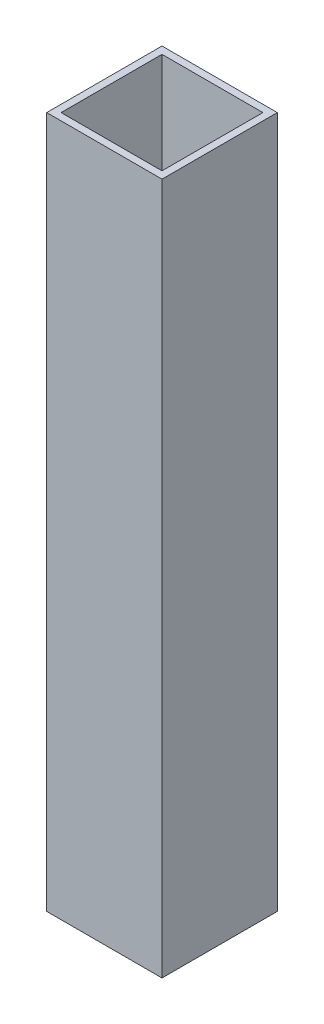
ISO-10303-21;
HEADER;
FILE_DESCRIPTION(('STEP AP214'),'2;1');
FILE_NAME('part.step','',(''),(''),'','','');
FILE_SCHEMA(('AUTOMOTIVE_DESIGN { 1 0 10303 214 1 1 1 1 }'));
ENDSEC;
DATA;
#1=APPLICATION_CONTEXT('core data for automotive mechanical design processes');
#2=APPLICATION_PROTOCOL_DEFINITION('international standard','automotive_design',2000,#1);
#3=PRODUCT_CONTEXT('',#1,'mechanical');
#4=PRODUCT('Part','Part','',(#3));
#5=PRODUCT_RELATED_PRODUCT_CATEGORY('part','',(#4));
#6=PRODUCT_DEFINITION_FORMATION('','',#4);
#7=PRODUCT_DEFINITION_CONTEXT('part definition',#1,'design');
#8=PRODUCT_DEFINITION('design','',#6,#7);
#9=PRODUCT_DEFINITION_SHAPE('','',#8);
#10=(LENGTH_UNIT() NAMED_UNIT(*) SI_UNIT(.MILLI.,.METRE.));
#11=(NAMED_UNIT(*) PLANE_ANGLE_UNIT() SI_UNIT($,.RADIAN.));
#12=(NAMED_UNIT(*) SI_UNIT($,.STERADIAN.) SOLID_ANGLE_UNIT());
#13=UNCERTAINTY_MEASURE_WITH_UNIT(LENGTH_MEASURE(1.E-05),#10,'distance_accuracy_value','');
#14=(GEOMETRIC_REPRESENTATION_CONTEXT(3) GLOBAL_UNCERTAINTY_ASSIGNED_CONTEXT((#13)) GLOBAL_UNIT_ASSIGNED_CONTEXT((#10,
#11,#12)) REPRESENTATION_CONTEXT('',''));
#15=CARTESIAN_POINT('',(0.,0.,0.));
#16=DIRECTION('',(0.,0.,1.));
#17=DIRECTION('',(1.,0.,0.));
#18=AXIS2_PLACEMENT_3D('',#15,#16,#17);
#19=CARTESIAN_POINT('',(0.,152.4,0.));
#20=DIRECTION('',(0.,-1.,0.));
#21=DIRECTION('',(0.,0.,-1.));
#22=AXIS2_PLACEMENT_3D('',#19,#20,#21);
#23=PLANE('',#22);
#24=DIRECTION('',(0.,0.,-1.));
#25=VECTOR('',#24,1.);
#26=CARTESIAN_POINT('',(12.7,152.4,12.7));
#27=LINE('',#26,#25);
#28=CARTESIAN_POINT('',(12.7,152.4,12.7));
#29=VERTEX_POINT('',#28);
#30=CARTESIAN_POINT('',(12.7,152.4,-12.7));
#31=VERTEX_POINT('',#30);
#32=EDGE_CURVE('E136',#29,#31,#27,.T.);
#33=ORIENTED_EDGE('',*,*,#32,.T.);
#34=DIRECTION('',(-1.,0.,0.));
#35=VECTOR('',#34,1.);
#36=CARTESIAN_POINT('',(-12.7,152.4,-12.7));
#37=LINE('',#36,#35);
#38=CARTESIAN_POINT('',(-12.7,152.4,-12.7));
#39=VERTEX_POINT('',#38);
#40=EDGE_CURVE('E139',#31,#39,#37,.T.);
#41=ORIENTED_EDGE('',*,*,#40,.T.);
#42=DIRECTION('',(0.,0.,1.));
#43=VECTOR('',#42,1.);
#44=CARTESIAN_POINT('',(-12.7,152.4,12.7));
#45=LINE('',#44,#43);
#46=CARTESIAN_POINT('',(-12.7,152.4,12.7));
#47=VERTEX_POINT('',#46);
#48=EDGE_CURVE('E142',#39,#47,#45,.T.);
#49=ORIENTED_EDGE('',*,*,#48,.T.);
#50=DIRECTION('',(1.,0.,0.));
#51=VECTOR('',#50,1.);
#52=CARTESIAN_POINT('',(-12.7,152.4,12.7));
#53=LINE('',#52,#51);
#54=EDGE_CURVE('E144',#47,#29,#53,.T.);
#55=ORIENTED_EDGE('',*,*,#54,.T.);
#56=EDGE_LOOP('',(#33,#41,#49,#55));
#57=FACE_BOUND('',#56,.T.);
#58=DIRECTION('',(0.,0.,-1.));
#59=VECTOR('',#58,1.);
#60=CARTESIAN_POINT('',(11.1125,152.4,11.1125));
#61=LINE('',#60,#59);
#62=CARTESIAN_POINT('',(11.1125,152.4,11.1125));
#63=VERTEX_POINT('',#62);
#64=CARTESIAN_POINT('',(11.1125,152.4,-11.1125));
#65=VERTEX_POINT('',#64);
#66=EDGE_CURVE('E100',#63,#65,#61,.T.);
#67=ORIENTED_EDGE('',*,*,#66,.F.);
#68=DIRECTION('',(1.,0.,0.));
#69=VECTOR('',#68,1.);
#70=CARTESIAN_POINT('',(-11.1125,152.4,11.1125));
#71=LINE('',#70,#69);
#72=CARTESIAN_POINT('',(-11.1125,152.4,11.1125));
#73=VERTEX_POINT('',#72);
#74=EDGE_CURVE('E122',#73,#63,#71,.T.);
#75=ORIENTED_EDGE('',*,*,#74,.F.);
#76=DIRECTION('',(0.,0.,1.));
#77=VECTOR('',#76,1.);
#78=CARTESIAN_POINT('',(-11.1125,152.4,11.1125));
#79=LINE('',#78,#77);
#80=CARTESIAN_POINT('',(-11.1125,152.4,-11.1125));
#81=VERTEX_POINT('',#80);
#82=EDGE_CURVE('E120',#81,#73,#79,.T.);
#83=ORIENTED_EDGE('',*,*,#82,.F.);
#84=DIRECTION('',(-1.,0.,0.));
#85=VECTOR('',#84,1.);
#86=CARTESIAN_POINT('',(-11.1125,152.4,-11.1125));
#87=LINE('',#86,#85);
#88=EDGE_CURVE('E108',#65,#81,#87,.T.);
#89=ORIENTED_EDGE('',*,*,#88,.F.);
#90=EDGE_LOOP('',(#67,#75,#83,#89));
#91=FACE_BOUND('',#90,.T.);
#92=ADVANCED_FACE('F35',(#57,#91),#23,.F.);
#93=CARTESIAN_POINT('',(0.,0.,0.));
#94=DIRECTION('',(0.,-1.,0.));
#95=DIRECTION('',(0.,0.,-1.));
#96=AXIS2_PLACEMENT_3D('',#93,#94,#95);
#97=PLANE('',#96);
#98=DIRECTION('',(0.,0.,-1.));
#99=VECTOR('',#98,1.);
#100=CARTESIAN_POINT('',(12.7,0.,12.7));
#101=LINE('',#100,#99);
#102=CARTESIAN_POINT('',(12.7,0.,12.7));
#103=VERTEX_POINT('',#102);
#104=CARTESIAN_POINT('',(12.7,0.,-12.7));
#105=VERTEX_POINT('',#104);
#106=EDGE_CURVE('E116',#103,#105,#101,.T.);
#107=ORIENTED_EDGE('',*,*,#106,.F.);
#108=DIRECTION('',(1.,0.,0.));
#109=VECTOR('',#108,1.);
#110=CARTESIAN_POINT('',(-12.7,0.,12.7));
#111=LINE('',#110,#109);
#112=CARTESIAN_POINT('',(-12.7,0.,12.7));
#113=VERTEX_POINT('',#112);
#114=EDGE_CURVE('E140',#113,#103,#111,.T.);
#115=ORIENTED_EDGE('',*,*,#114,.F.);
#116=DIRECTION('',(0.,0.,1.));
#117=VECTOR('',#116,1.);
#118=CARTESIAN_POINT('',(-12.7,0.,12.7));
#119=LINE('',#118,#117);
#120=CARTESIAN_POINT('',(-12.7,0.,-12.7));
#121=VERTEX_POINT('',#120);
#122=EDGE_CURVE('E151',#121,#113,#119,.T.);
#123=ORIENTED_EDGE('',*,*,#122,.F.);
#124=DIRECTION('',(-1.,0.,0.));
#125=VECTOR('',#124,1.);
#126=CARTESIAN_POINT('',(-12.7,0.,-12.7));
#127=LINE('',#126,#125);
#128=EDGE_CURVE('E149',#105,#121,#127,.T.);
#129=ORIENTED_EDGE('',*,*,#128,.F.);
#130=EDGE_LOOP('',(#107,#115,#123,#129));
#131=FACE_BOUND('',#130,.T.);
#132=DIRECTION('',(1.,0.,0.));
#133=VECTOR('',#132,1.);
#134=CARTESIAN_POINT('',(-11.1125,0.,11.1125));
#135=LINE('',#134,#133);
#136=CARTESIAN_POINT('',(-11.1125,0.,11.1125));
#137=VERTEX_POINT('',#136);
#138=CARTESIAN_POINT('',(11.1125,0.,11.1125));
#139=VERTEX_POINT('',#138);
#140=EDGE_CURVE('E109',#137,#139,#135,.T.);
#141=ORIENTED_EDGE('',*,*,#140,.T.);
#142=DIRECTION('',(0.,0.,-1.));
#143=VECTOR('',#142,1.);
#144=CARTESIAN_POINT('',(11.1125,0.,11.1125));
#145=LINE('',#144,#143);
#146=CARTESIAN_POINT('',(11.1125,0.,-11.1125));
#147=VERTEX_POINT('',#146);
#148=EDGE_CURVE('E58',#139,#147,#145,.T.);
#149=ORIENTED_EDGE('',*,*,#148,.T.);
#150=DIRECTION('',(-1.,0.,0.));
#151=VECTOR('',#150,1.);
#152=CARTESIAN_POINT('',(-11.1125,0.,-11.1125));
#153=LINE('',#152,#151);
#154=CARTESIAN_POINT('',(-11.1125,0.,-11.1125));
#155=VERTEX_POINT('',#154);
#156=EDGE_CURVE('E115',#147,#155,#153,.T.);
#157=ORIENTED_EDGE('',*,*,#156,.T.);
#158=DIRECTION('',(0.,0.,1.));
#159=VECTOR('',#158,1.);
#160=CARTESIAN_POINT('',(-11.1125,0.,11.1125));
#161=LINE('',#160,#159);
#162=EDGE_CURVE('E128',#155,#137,#161,.T.);
#163=ORIENTED_EDGE('',*,*,#162,.T.);
#164=EDGE_LOOP('',(#141,#149,#157,#163));
#165=FACE_BOUND('',#164,.T.);
#166=ADVANCED_FACE('F169',(#131,#165),#97,.T.);
#167=CARTESIAN_POINT('',(12.7,152.4,12.7));
#168=DIRECTION('',(-1.,0.,0.));
#169=DIRECTION('',(0.,0.,1.));
#170=AXIS2_PLACEMENT_3D('',#167,#168,#169);
#171=PLANE('',#170);
#172=ORIENTED_EDGE('',*,*,#106,.T.);
#173=DIRECTION('',(0.,-1.,0.));
#174=VECTOR('',#173,1.);
#175=CARTESIAN_POINT('',(12.7,152.4,-12.7));
#176=LINE('',#175,#174);
#177=EDGE_CURVE('E11',#31,#105,#176,.T.);
#178=ORIENTED_EDGE('',*,*,#177,.F.);
#179=ORIENTED_EDGE('',*,*,#32,.F.);
#180=DIRECTION('',(0.,-1.,0.));
#181=VECTOR('',#180,1.);
#182=CARTESIAN_POINT('',(12.7,152.4,12.7));
#183=LINE('',#182,#181);
#184=EDGE_CURVE('E146',#29,#103,#183,.T.);
#185=ORIENTED_EDGE('',*,*,#184,.T.);
#186=EDGE_LOOP('',(#172,#178,#179,#185));
#187=FACE_BOUND('',#186,.T.);
#188=ADVANCED_FACE('F37',(#187),#171,.F.);
#189=CARTESIAN_POINT('',(-12.7,152.4,-12.7));
#190=DIRECTION('',(0.,0.,1.));
#191=DIRECTION('',(1.,0.,0.));
#192=AXIS2_PLACEMENT_3D('',#189,#190,#191);
#193=PLANE('',#192);
#194=ORIENTED_EDGE('',*,*,#128,.T.);
#195=DIRECTION('',(0.,-1.,0.));
#196=VECTOR('',#195,1.);
#197=CARTESIAN_POINT('',(-12.7,152.4,-12.7));
#198=LINE('',#197,#196);
#199=EDGE_CURVE('E43',#39,#121,#198,.T.);
#200=ORIENTED_EDGE('',*,*,#199,.F.);
#201=ORIENTED_EDGE('',*,*,#40,.F.);
#202=ORIENTED_EDGE('',*,*,#177,.T.);
#203=EDGE_LOOP('',(#194,#200,#201,#202));
#204=FACE_BOUND('',#203,.T.);
#205=ADVANCED_FACE('F179',(#204),#193,.F.);
#206=CARTESIAN_POINT('',(-12.7,152.4,12.7));
#207=DIRECTION('',(1.,0.,0.));
#208=DIRECTION('',(0.,0.,-1.));
#209=AXIS2_PLACEMENT_3D('',#206,#207,#208);
#210=PLANE('',#209);
#211=ORIENTED_EDGE('',*,*,#122,.T.);
#212=DIRECTION('',(0.,-1.,0.));
#213=VECTOR('',#212,1.);
#214=CARTESIAN_POINT('',(-12.7,152.4,12.7));
#215=LINE('',#214,#213);
#216=EDGE_CURVE('E156',#47,#113,#215,.T.);
#217=ORIENTED_EDGE('',*,*,#216,.F.);
#218=ORIENTED_EDGE('',*,*,#48,.F.);
#219=ORIENTED_EDGE('',*,*,#199,.T.);
#220=EDGE_LOOP('',(#211,#217,#218,#219));
#221=FACE_BOUND('',#220,.T.);
#222=ADVANCED_FACE('F163',(#221),#210,.F.);
#223=CARTESIAN_POINT('',(-12.7,152.4,12.7));
#224=DIRECTION('',(0.,0.,-1.));
#225=DIRECTION('',(-1.,0.,0.));
#226=AXIS2_PLACEMENT_3D('',#223,#224,#225);
#227=PLANE('',#226);
#228=ORIENTED_EDGE('',*,*,#114,.T.);
#229=ORIENTED_EDGE('',*,*,#184,.F.);
#230=ORIENTED_EDGE('',*,*,#54,.F.);
#231=ORIENTED_EDGE('',*,*,#216,.T.);
#232=EDGE_LOOP('',(#228,#229,#230,#231));
#233=FACE_BOUND('',#232,.T.);
#234=ADVANCED_FACE('F173',(#233),#227,.F.);
#235=CARTESIAN_POINT('',(11.1125,152.4,11.1125));
#236=DIRECTION('',(-1.,0.,0.));
#237=DIRECTION('',(0.,0.,1.));
#238=AXIS2_PLACEMENT_3D('',#235,#236,#237);
#239=PLANE('',#238);
#240=ORIENTED_EDGE('',*,*,#148,.F.);
#241=DIRECTION('',(0.,-1.,0.));
#242=VECTOR('',#241,1.);
#243=CARTESIAN_POINT('',(11.1125,152.4,11.1125));
#244=LINE('',#243,#242);
#245=EDGE_CURVE('E104',#63,#139,#244,.T.);
#246=ORIENTED_EDGE('',*,*,#245,.F.);
#247=ORIENTED_EDGE('',*,*,#66,.T.);
#248=DIRECTION('',(0.,-1.,0.));
#249=VECTOR('',#248,1.);
#250=CARTESIAN_POINT('',(11.1125,152.4,-11.1125));
#251=LINE('',#250,#249);
#252=EDGE_CURVE('E103',#65,#147,#251,.T.);
#253=ORIENTED_EDGE('',*,*,#252,.T.);
#254=EDGE_LOOP('',(#240,#246,#247,#253));
#255=FACE_BOUND('',#254,.T.);
#256=ADVANCED_FACE('F102',(#255),#239,.T.);
#257=CARTESIAN_POINT('',(-11.1125,152.4,-11.1125));
#258=DIRECTION('',(0.,0.,1.));
#259=DIRECTION('',(1.,0.,0.));
#260=AXIS2_PLACEMENT_3D('',#257,#258,#259);
#261=PLANE('',#260);
#262=ORIENTED_EDGE('',*,*,#156,.F.);
#263=ORIENTED_EDGE('',*,*,#252,.F.);
#264=ORIENTED_EDGE('',*,*,#88,.T.);
#265=DIRECTION('',(0.,-1.,0.));
#266=VECTOR('',#265,1.);
#267=CARTESIAN_POINT('',(-11.1125,152.4,-11.1125));
#268=LINE('',#267,#266);
#269=EDGE_CURVE('E117',#81,#155,#268,.T.);
#270=ORIENTED_EDGE('',*,*,#269,.T.);
#271=EDGE_LOOP('',(#262,#263,#264,#270));
#272=FACE_BOUND('',#271,.T.);
#273=ADVANCED_FACE('F112',(#272),#261,.T.);
#274=CARTESIAN_POINT('',(-11.1125,152.4,11.1125));
#275=DIRECTION('',(1.,0.,0.));
#276=DIRECTION('',(0.,0.,-1.));
#277=AXIS2_PLACEMENT_3D('',#274,#275,#276);
#278=PLANE('',#277);
#279=ORIENTED_EDGE('',*,*,#162,.F.);
#280=ORIENTED_EDGE('',*,*,#269,.F.);
#281=ORIENTED_EDGE('',*,*,#82,.T.);
#282=DIRECTION('',(0.,-1.,0.));
#283=VECTOR('',#282,1.);
#284=CARTESIAN_POINT('',(-11.1125,152.4,11.1125));
#285=LINE('',#284,#283);
#286=EDGE_CURVE('E50',#73,#137,#285,.T.);
#287=ORIENTED_EDGE('',*,*,#286,.T.);
#288=EDGE_LOOP('',(#279,#280,#281,#287));
#289=FACE_BOUND('',#288,.T.);
#290=ADVANCED_FACE('F202',(#289),#278,.T.);
#291=CARTESIAN_POINT('',(-11.1125,152.4,11.1125));
#292=DIRECTION('',(0.,0.,-1.));
#293=DIRECTION('',(-1.,0.,0.));
#294=AXIS2_PLACEMENT_3D('',#291,#292,#293);
#295=PLANE('',#294);
#296=ORIENTED_EDGE('',*,*,#140,.F.);
#297=ORIENTED_EDGE('',*,*,#286,.F.);
#298=ORIENTED_EDGE('',*,*,#74,.T.);
#299=ORIENTED_EDGE('',*,*,#245,.T.);
#300=EDGE_LOOP('',(#296,#297,#298,#299));
#301=FACE_BOUND('',#300,.T.);
#302=ADVANCED_FACE('F206',(#301),#295,.T.);
#303=CLOSED_SHELL('',(#92,#166,#188,#205,#222,#234,#256,#273,#290,#302));
#304=MANIFOLD_SOLID_BREP('B2',#303);
#305=ADVANCED_BREP_SHAPE_REPRESENTATION('',(#18,#304),#14);
#306=SHAPE_DEFINITION_REPRESENTATION(#9,#305);
ENDSEC;
END-ISO-10303-21;
